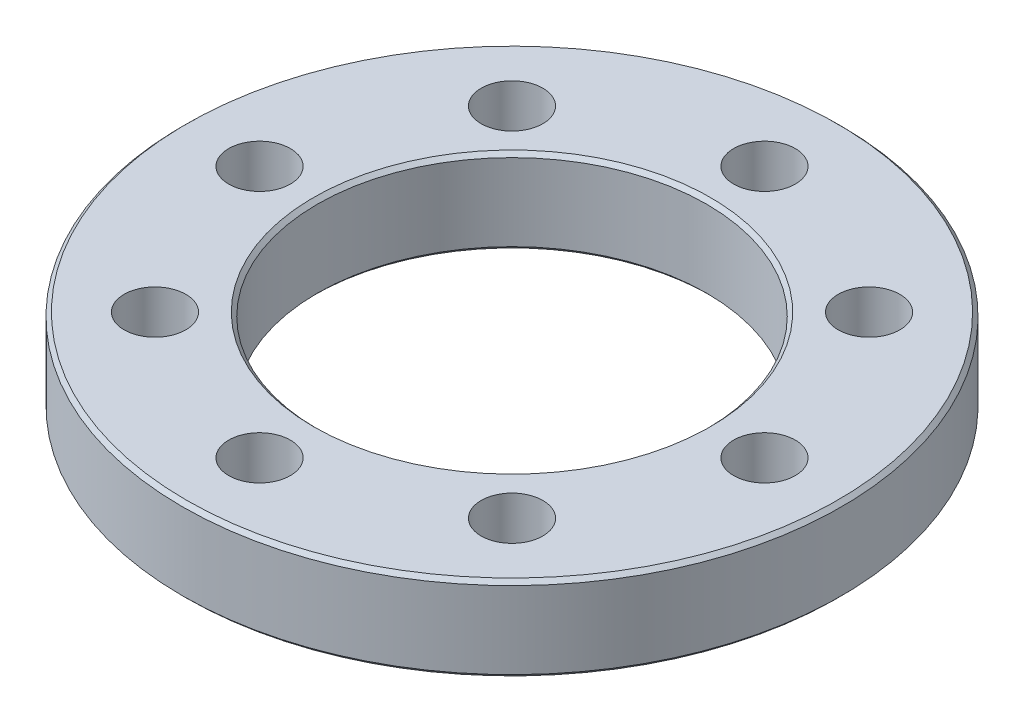
ISO-10303-21;
HEADER;
FILE_DESCRIPTION(('STEP AP214'),'2;1');
FILE_NAME('part.step','',(''),(''),'','','');
FILE_SCHEMA(('AUTOMOTIVE_DESIGN { 1 0 10303 214 1 1 1 1 }'));
ENDSEC;
DATA;
#1=APPLICATION_CONTEXT('core data for automotive mechanical design processes');
#2=APPLICATION_PROTOCOL_DEFINITION('international standard','automotive_design',2000,#1);
#3=PRODUCT_CONTEXT('',#1,'mechanical');
#4=PRODUCT('Part','Part','',(#3));
#5=PRODUCT_RELATED_PRODUCT_CATEGORY('part','',(#4));
#6=PRODUCT_DEFINITION_FORMATION('','',#4);
#7=PRODUCT_DEFINITION_CONTEXT('part definition',#1,'design');
#8=PRODUCT_DEFINITION('design','',#6,#7);
#9=PRODUCT_DEFINITION_SHAPE('','',#8);
#10=(LENGTH_UNIT() NAMED_UNIT(*) SI_UNIT(.MILLI.,.METRE.));
#11=(NAMED_UNIT(*) PLANE_ANGLE_UNIT() SI_UNIT($,.RADIAN.));
#12=(NAMED_UNIT(*) SI_UNIT($,.STERADIAN.) SOLID_ANGLE_UNIT());
#13=UNCERTAINTY_MEASURE_WITH_UNIT(LENGTH_MEASURE(1.E-05),#10,'distance_accuracy_value','');
#14=(GEOMETRIC_REPRESENTATION_CONTEXT(3) GLOBAL_UNCERTAINTY_ASSIGNED_CONTEXT((#13)) GLOBAL_UNIT_ASSIGNED_CONTEXT((#10,
#11,#12)) REPRESENTATION_CONTEXT('',''));
#15=CARTESIAN_POINT('',(0.,0.,0.));
#16=DIRECTION('',(0.,0.,1.));
#17=DIRECTION('',(1.,0.,0.));
#18=AXIS2_PLACEMENT_3D('',#15,#16,#17);
#19=CARTESIAN_POINT('',(0.,22.,0.));
#20=DIRECTION('',(0.,1.,0.));
#21=DIRECTION('',(0.,0.,1.));
#22=AXIS2_PLACEMENT_3D('',#19,#20,#21);
#23=PLANE('',#22);
#24=CARTESIAN_POINT('',(65.5,22.,0.));
#25=DIRECTION('',(0.,1.,0.));
#26=DIRECTION('',(0.,0.,1.));
#27=AXIS2_PLACEMENT_3D('',#24,#25,#26);
#28=CIRCLE('',#27,8.00000000000002);
#29=CARTESIAN_POINT('',(65.5,22.,8.00000000000002));
#30=VERTEX_POINT('',#29);
#31=EDGE_CURVE('E117',#30,#30,#28,.T.);
#32=ORIENTED_EDGE('',*,*,#31,.F.);
#33=EDGE_LOOP('',(#32));
#34=FACE_BOUND('',#33,.T.);
#35=CARTESIAN_POINT('',(46.3154941677188,22.,46.315494167719));
#36=DIRECTION('',(0.,1.,0.));
#37=DIRECTION('',(0.,0.,1.));
#38=AXIS2_PLACEMENT_3D('',#35,#36,#37);
#39=CIRCLE('',#38,8.00000000000001);
#40=CARTESIAN_POINT('',(46.3154941677188,22.,54.315494167719));
#41=VERTEX_POINT('',#40);
#42=EDGE_CURVE('E111',#41,#41,#39,.T.);
#43=ORIENTED_EDGE('',*,*,#42,.F.);
#44=EDGE_LOOP('',(#43));
#45=FACE_BOUND('',#44,.T.);
#46=CARTESIAN_POINT('',(-2.28692027694225E-13,22.,65.5));
#47=DIRECTION('',(0.,1.,0.));
#48=DIRECTION('',(0.,0.,1.));
#49=AXIS2_PLACEMENT_3D('',#46,#47,#48);
#50=CIRCLE('',#49,8.00000000000001);
#51=CARTESIAN_POINT('',(-2.28692027694225E-13,22.,73.5));
#52=VERTEX_POINT('',#51);
#53=EDGE_CURVE('E105',#52,#52,#50,.T.);
#54=ORIENTED_EDGE('',*,*,#53,.F.);
#55=EDGE_LOOP('',(#54));
#56=FACE_BOUND('',#55,.T.);
#57=CARTESIAN_POINT('',(-46.3154941677191,22.,46.3154941677186));
#58=DIRECTION('',(0.,1.,0.));
#59=DIRECTION('',(0.,0.,1.));
#60=AXIS2_PLACEMENT_3D('',#57,#58,#59);
#61=CIRCLE('',#60,8.00000000000001);
#62=CARTESIAN_POINT('',(-46.3154941677191,22.,54.3154941677187));
#63=VERTEX_POINT('',#62);
#64=EDGE_CURVE('E99',#63,#63,#61,.T.);
#65=ORIENTED_EDGE('',*,*,#64,.F.);
#66=EDGE_LOOP('',(#65));
#67=FACE_BOUND('',#66,.T.);
#68=CARTESIAN_POINT('',(-65.5,22.,-4.57384055388451E-13));
#69=DIRECTION('',(0.,1.,0.));
#70=DIRECTION('',(0.,0.,1.));
#71=AXIS2_PLACEMENT_3D('',#68,#69,#70);
#72=CIRCLE('',#71,8.00000000000001);
#73=CARTESIAN_POINT('',(-65.5,22.,7.99999999999956));
#74=VERTEX_POINT('',#73);
#75=EDGE_CURVE('E93',#74,#74,#72,.T.);
#76=ORIENTED_EDGE('',*,*,#75,.F.);
#77=EDGE_LOOP('',(#76));
#78=FACE_BOUND('',#77,.T.);
#79=CARTESIAN_POINT('',(-46.3154941677185,22.,-46.3154941677193));
#80=DIRECTION('',(0.,1.,0.));
#81=DIRECTION('',(0.,0.,1.));
#82=AXIS2_PLACEMENT_3D('',#79,#80,#81);
#83=CIRCLE('',#82,8.00000000000001);
#84=CARTESIAN_POINT('',(-46.3154941677185,22.,-38.3154941677193));
#85=VERTEX_POINT('',#84);
#86=EDGE_CURVE('E87',#85,#85,#83,.T.);
#87=ORIENTED_EDGE('',*,*,#86,.F.);
#88=EDGE_LOOP('',(#87));
#89=FACE_BOUND('',#88,.T.);
#90=CARTESIAN_POINT('',(6.86076083082676E-13,22.,-65.5));
#91=DIRECTION('',(0.,1.,0.));
#92=DIRECTION('',(0.,0.,1.));
#93=AXIS2_PLACEMENT_3D('',#90,#91,#92);
#94=CIRCLE('',#93,8.00000000000001);
#95=CARTESIAN_POINT('',(6.86076083082676E-13,22.,-57.5));
#96=VERTEX_POINT('',#95);
#97=EDGE_CURVE('E81',#96,#96,#94,.T.);
#98=ORIENTED_EDGE('',*,*,#97,.F.);
#99=EDGE_LOOP('',(#98));
#100=FACE_BOUND('',#99,.T.);
#101=CARTESIAN_POINT('',(46.3154941677194,22.,-46.3154941677183));
#102=DIRECTION('',(0.,1.,0.));
#103=DIRECTION('',(0.,0.,1.));
#104=AXIS2_PLACEMENT_3D('',#101,#102,#103);
#105=CIRCLE('',#104,8.00000000000001);
#106=CARTESIAN_POINT('',(46.3154941677194,22.,-38.3154941677183));
#107=VERTEX_POINT('',#106);
#108=EDGE_CURVE('E75',#107,#107,#105,.T.);
#109=ORIENTED_EDGE('',*,*,#108,.F.);
#110=EDGE_LOOP('',(#109));
#111=FACE_BOUND('',#110,.T.);
#112=CARTESIAN_POINT('',(0.,22.,0.));
#113=DIRECTION('',(0.,1.,0.));
#114=DIRECTION('',(0.,0.,1.));
#115=AXIS2_PLACEMENT_3D('',#112,#113,#114);
#116=CIRCLE('',#115,84.5);
#117=CARTESIAN_POINT('',(0.,22.,84.5));
#118=VERTEX_POINT('',#117);
#119=EDGE_CURVE('E51',#118,#118,#116,.T.);
#120=ORIENTED_EDGE('',*,*,#119,.T.);
#121=EDGE_LOOP('',(#120));
#122=FACE_BOUND('',#121,.T.);
#123=CARTESIAN_POINT('',(0.,22.,0.));
#124=DIRECTION('',(0.,1.,0.));
#125=DIRECTION('',(0.,0.,1.));
#126=AXIS2_PLACEMENT_3D('',#123,#124,#125);
#127=CIRCLE('',#126,51.5);
#128=CARTESIAN_POINT('',(0.,22.,51.5));
#129=VERTEX_POINT('',#128);
#130=EDGE_CURVE('E55',#129,#129,#127,.F.);
#131=ORIENTED_EDGE('',*,*,#130,.T.);
#132=EDGE_LOOP('',(#131));
#133=FACE_BOUND('',#132,.T.);
#134=ADVANCED_FACE('F39',(#34,#45,#56,#67,#78,#89,#100,#111,#122,#133),#23,.T.);
#135=CARTESIAN_POINT('',(0.,0.,0.));
#136=DIRECTION('',(0.,1.,0.));
#137=DIRECTION('',(0.,0.,1.));
#138=AXIS2_PLACEMENT_3D('',#135,#136,#137);
#139=PLANE('',#138);
#140=CARTESIAN_POINT('',(65.5,0.,0.));
#141=DIRECTION('',(0.,1.,0.));
#142=DIRECTION('',(0.,0.,1.));
#143=AXIS2_PLACEMENT_3D('',#140,#141,#142);
#144=CIRCLE('',#143,8.00000000000001);
#145=CARTESIAN_POINT('',(65.5,0.,8.00000000000001));
#146=VERTEX_POINT('',#145);
#147=EDGE_CURVE('E114',#146,#146,#144,.T.);
#148=ORIENTED_EDGE('',*,*,#147,.T.);
#149=EDGE_LOOP('',(#148));
#150=FACE_BOUND('',#149,.T.);
#151=CARTESIAN_POINT('',(46.3154941677188,0.,46.315494167719));
#152=DIRECTION('',(0.,1.,0.));
#153=DIRECTION('',(0.,0.,1.));
#154=AXIS2_PLACEMENT_3D('',#151,#152,#153);
#155=CIRCLE('',#154,8.00000000000001);
#156=CARTESIAN_POINT('',(46.3154941677188,0.,54.315494167719));
#157=VERTEX_POINT('',#156);
#158=EDGE_CURVE('E108',#157,#157,#155,.T.);
#159=ORIENTED_EDGE('',*,*,#158,.T.);
#160=EDGE_LOOP('',(#159));
#161=FACE_BOUND('',#160,.T.);
#162=CARTESIAN_POINT('',(-2.28692027694225E-13,0.,65.5));
#163=DIRECTION('',(0.,1.,0.));
#164=DIRECTION('',(0.,0.,1.));
#165=AXIS2_PLACEMENT_3D('',#162,#163,#164);
#166=CIRCLE('',#165,8.00000000000001);
#167=CARTESIAN_POINT('',(-2.28692027694225E-13,0.,73.5));
#168=VERTEX_POINT('',#167);
#169=EDGE_CURVE('E102',#168,#168,#166,.T.);
#170=ORIENTED_EDGE('',*,*,#169,.T.);
#171=EDGE_LOOP('',(#170));
#172=FACE_BOUND('',#171,.T.);
#173=CARTESIAN_POINT('',(-46.3154941677191,0.,46.3154941677186));
#174=DIRECTION('',(0.,1.,0.));
#175=DIRECTION('',(0.,0.,1.));
#176=AXIS2_PLACEMENT_3D('',#173,#174,#175);
#177=CIRCLE('',#176,8.00000000000001);
#178=CARTESIAN_POINT('',(-46.3154941677191,0.,54.3154941677186));
#179=VERTEX_POINT('',#178);
#180=EDGE_CURVE('E96',#179,#179,#177,.T.);
#181=ORIENTED_EDGE('',*,*,#180,.T.);
#182=EDGE_LOOP('',(#181));
#183=FACE_BOUND('',#182,.T.);
#184=CARTESIAN_POINT('',(-65.5,0.,-4.57384055388451E-13));
#185=DIRECTION('',(0.,1.,0.));
#186=DIRECTION('',(0.,0.,1.));
#187=AXIS2_PLACEMENT_3D('',#184,#185,#186);
#188=CIRCLE('',#187,8.00000000000001);
#189=CARTESIAN_POINT('',(-65.5,0.,7.99999999999955));
#190=VERTEX_POINT('',#189);
#191=EDGE_CURVE('E90',#190,#190,#188,.T.);
#192=ORIENTED_EDGE('',*,*,#191,.T.);
#193=EDGE_LOOP('',(#192));
#194=FACE_BOUND('',#193,.T.);
#195=CARTESIAN_POINT('',(-46.3154941677185,0.,-46.3154941677193));
#196=DIRECTION('',(0.,1.,0.));
#197=DIRECTION('',(0.,0.,1.));
#198=AXIS2_PLACEMENT_3D('',#195,#196,#197);
#199=CIRCLE('',#198,8.00000000000001);
#200=CARTESIAN_POINT('',(-46.3154941677185,0.,-38.3154941677193));
#201=VERTEX_POINT('',#200);
#202=EDGE_CURVE('E84',#201,#201,#199,.T.);
#203=ORIENTED_EDGE('',*,*,#202,.T.);
#204=EDGE_LOOP('',(#203));
#205=FACE_BOUND('',#204,.T.);
#206=CARTESIAN_POINT('',(6.86076083082676E-13,0.,-65.5));
#207=DIRECTION('',(0.,1.,0.));
#208=DIRECTION('',(0.,0.,1.));
#209=AXIS2_PLACEMENT_3D('',#206,#207,#208);
#210=CIRCLE('',#209,8.00000000000001);
#211=CARTESIAN_POINT('',(6.86076083082676E-13,0.,-57.5));
#212=VERTEX_POINT('',#211);
#213=EDGE_CURVE('E78',#212,#212,#210,.T.);
#214=ORIENTED_EDGE('',*,*,#213,.T.);
#215=EDGE_LOOP('',(#214));
#216=FACE_BOUND('',#215,.T.);
#217=CARTESIAN_POINT('',(46.3154941677194,0.,-46.3154941677183));
#218=DIRECTION('',(0.,1.,0.));
#219=DIRECTION('',(0.,0.,1.));
#220=AXIS2_PLACEMENT_3D('',#217,#218,#219);
#221=CIRCLE('',#220,8.00000000000001);
#222=CARTESIAN_POINT('',(46.3154941677194,0.,-38.3154941677183));
#223=VERTEX_POINT('',#222);
#224=EDGE_CURVE('E72',#223,#223,#221,.T.);
#225=ORIENTED_EDGE('',*,*,#224,.T.);
#226=EDGE_LOOP('',(#225));
#227=FACE_BOUND('',#226,.T.);
#228=CARTESIAN_POINT('',(0.,0.,0.));
#229=DIRECTION('',(0.,1.,0.));
#230=DIRECTION('',(0.,0.,1.));
#231=AXIS2_PLACEMENT_3D('',#228,#229,#230);
#232=CIRCLE('',#231,84.5);
#233=CARTESIAN_POINT('',(0.,0.,84.5));
#234=VERTEX_POINT('',#233);
#235=EDGE_CURVE('E60',#234,#234,#232,.F.);
#236=ORIENTED_EDGE('',*,*,#235,.T.);
#237=EDGE_LOOP('',(#236));
#238=FACE_BOUND('',#237,.T.);
#239=CARTESIAN_POINT('',(0.,0.,0.));
#240=DIRECTION('',(0.,1.,0.));
#241=DIRECTION('',(0.,0.,1.));
#242=AXIS2_PLACEMENT_3D('',#239,#240,#241);
#243=CIRCLE('',#242,51.5);
#244=CARTESIAN_POINT('',(0.,0.,51.5));
#245=VERTEX_POINT('',#244);
#246=EDGE_CURVE('E63',#245,#245,#243,.T.);
#247=ORIENTED_EDGE('',*,*,#246,.T.);
#248=EDGE_LOOP('',(#247));
#249=FACE_BOUND('',#248,.T.);
#250=ADVANCED_FACE('F125',(#150,#161,#172,#183,#194,#205,#216,#227,#238,#249),#139,.F.);
#251=CARTESIAN_POINT('',(0.,22.,0.));
#252=DIRECTION('',(0.,-1.,0.));
#253=DIRECTION('',(0.,0.,-1.));
#254=AXIS2_PLACEMENT_3D('',#251,#252,#253);
#255=CYLINDRICAL_SURFACE('',#254,85.5);
#256=CARTESIAN_POINT('',(0.,1.,0.));
#257=DIRECTION('',(0.,1.,0.));
#258=DIRECTION('',(0.,0.,1.));
#259=AXIS2_PLACEMENT_3D('',#256,#257,#258);
#260=CIRCLE('',#259,85.5);
#261=CARTESIAN_POINT('',(0.,1.,85.5));
#262=VERTEX_POINT('',#261);
#263=EDGE_CURVE('E66',#262,#262,#260,.T.);
#264=ORIENTED_EDGE('',*,*,#263,.T.);
#265=EDGE_LOOP('',(#264));
#266=FACE_BOUND('',#265,.T.);
#267=CARTESIAN_POINT('',(0.,21.,0.));
#268=DIRECTION('',(0.,1.,0.));
#269=DIRECTION('',(0.,0.,1.));
#270=AXIS2_PLACEMENT_3D('',#267,#268,#269);
#271=CIRCLE('',#270,85.5);
#272=CARTESIAN_POINT('',(0.,21.,85.5));
#273=VERTEX_POINT('',#272);
#274=EDGE_CURVE('E69',#273,#273,#271,.F.);
#275=ORIENTED_EDGE('',*,*,#274,.T.);
#276=EDGE_LOOP('',(#275));
#277=FACE_BOUND('',#276,.T.);
#278=ADVANCED_FACE('F179',(#266,#277),#255,.T.);
#279=CARTESIAN_POINT('',(0.,22.,0.));
#280=DIRECTION('',(0.,-1.,0.));
#281=DIRECTION('',(0.,0.,-1.));
#282=AXIS2_PLACEMENT_3D('',#279,#280,#281);
#283=CYLINDRICAL_SURFACE('',#282,50.5);
#284=CARTESIAN_POINT('',(0.,1.00000000000001,0.));
#285=DIRECTION('',(0.,1.,0.));
#286=DIRECTION('',(0.,0.,1.));
#287=AXIS2_PLACEMENT_3D('',#284,#285,#286);
#288=CIRCLE('',#287,50.5);
#289=CARTESIAN_POINT('',(0.,1.00000000000001,50.5));
#290=VERTEX_POINT('',#289);
#291=EDGE_CURVE('E10',#290,#290,#288,.F.);
#292=ORIENTED_EDGE('',*,*,#291,.T.);
#293=EDGE_LOOP('',(#292));
#294=FACE_BOUND('',#293,.T.);
#295=CARTESIAN_POINT('',(0.,21.,0.));
#296=DIRECTION('',(0.,1.,0.));
#297=DIRECTION('',(0.,0.,1.));
#298=AXIS2_PLACEMENT_3D('',#295,#296,#297);
#299=CIRCLE('',#298,50.5);
#300=CARTESIAN_POINT('',(0.,21.,50.5));
#301=VERTEX_POINT('',#300);
#302=EDGE_CURVE('E47',#301,#301,#299,.T.);
#303=ORIENTED_EDGE('',*,*,#302,.T.);
#304=EDGE_LOOP('',(#303));
#305=FACE_BOUND('',#304,.T.);
#306=ADVANCED_FACE('F177',(#294,#305),#283,.F.);
#307=CARTESIAN_POINT('',(0.,1.,0.));
#308=DIRECTION('',(0.,1.,0.));
#309=DIRECTION('',(0.,0.,1.));
#310=AXIS2_PLACEMENT_3D('',#307,#308,#309);
#311=CONICAL_SURFACE('',#310,85.5,0.785398163397455);
#312=ORIENTED_EDGE('',*,*,#235,.F.);
#313=EDGE_LOOP('',(#312));
#314=FACE_BOUND('',#313,.T.);
#315=ORIENTED_EDGE('',*,*,#263,.F.);
#316=EDGE_LOOP('',(#315));
#317=FACE_BOUND('',#316,.T.);
#318=ADVANCED_FACE('F161',(#314,#317),#311,.T.);
#319=CARTESIAN_POINT('',(0.,22.,0.));
#320=DIRECTION('',(0.,-1.,0.));
#321=DIRECTION('',(0.,0.,-1.));
#322=AXIS2_PLACEMENT_3D('',#319,#320,#321);
#323=CONICAL_SURFACE('',#322,84.5,0.785398163397441);
#324=ORIENTED_EDGE('',*,*,#274,.F.);
#325=EDGE_LOOP('',(#324));
#326=FACE_BOUND('',#325,.T.);
#327=ORIENTED_EDGE('',*,*,#119,.F.);
#328=EDGE_LOOP('',(#327));
#329=FACE_BOUND('',#328,.T.);
#330=ADVANCED_FACE('F156',(#326,#329),#323,.T.);
#331=CARTESIAN_POINT('',(0.,0.,0.));
#332=DIRECTION('',(0.,-1.,0.));
#333=DIRECTION('',(0.,0.,-1.));
#334=AXIS2_PLACEMENT_3D('',#331,#332,#333);
#335=CONICAL_SURFACE('',#334,51.5,0.785398163397434);
#336=ORIENTED_EDGE('',*,*,#291,.F.);
#337=EDGE_LOOP('',(#336));
#338=FACE_BOUND('',#337,.T.);
#339=ORIENTED_EDGE('',*,*,#246,.F.);
#340=EDGE_LOOP('',(#339));
#341=FACE_BOUND('',#340,.T.);
#342=ADVANCED_FACE('F148',(#338,#341),#335,.F.);
#343=CARTESIAN_POINT('',(0.,21.,0.));
#344=DIRECTION('',(0.,1.,0.));
#345=DIRECTION('',(0.,0.,1.));
#346=AXIS2_PLACEMENT_3D('',#343,#344,#345);
#347=CONICAL_SURFACE('',#346,50.5,0.785398163397455);
#348=ORIENTED_EDGE('',*,*,#130,.F.);
#349=EDGE_LOOP('',(#348));
#350=FACE_BOUND('',#349,.T.);
#351=ORIENTED_EDGE('',*,*,#302,.F.);
#352=EDGE_LOOP('',(#351));
#353=FACE_BOUND('',#352,.T.);
#354=ADVANCED_FACE('F42',(#350,#353),#347,.F.);
#355=CARTESIAN_POINT('',(46.3154941677194,22.,-46.3154941677183));
#356=DIRECTION('',(0.,1.,0.));
#357=DIRECTION('',(0.,0.,1.));
#358=AXIS2_PLACEMENT_3D('',#355,#356,#357);
#359=CYLINDRICAL_SURFACE('',#358,8.00000000000001);
#360=ORIENTED_EDGE('',*,*,#224,.F.);
#361=EDGE_LOOP('',(#360));
#362=FACE_BOUND('',#361,.T.);
#363=ORIENTED_EDGE('',*,*,#108,.T.);
#364=EDGE_LOOP('',(#363));
#365=FACE_BOUND('',#364,.T.);
#366=ADVANCED_FACE('F147',(#362,#365),#359,.F.);
#367=CARTESIAN_POINT('',(6.86076083082676E-13,22.,-65.5));
#368=DIRECTION('',(0.,1.,0.));
#369=DIRECTION('',(0.,0.,1.));
#370=AXIS2_PLACEMENT_3D('',#367,#368,#369);
#371=CYLINDRICAL_SURFACE('',#370,8.00000000000001);
#372=ORIENTED_EDGE('',*,*,#213,.F.);
#373=EDGE_LOOP('',(#372));
#374=FACE_BOUND('',#373,.T.);
#375=ORIENTED_EDGE('',*,*,#97,.T.);
#376=EDGE_LOOP('',(#375));
#377=FACE_BOUND('',#376,.T.);
#378=ADVANCED_FACE('F153',(#374,#377),#371,.F.);
#379=CARTESIAN_POINT('',(-46.3154941677185,22.,-46.3154941677193));
#380=DIRECTION('',(0.,1.,0.));
#381=DIRECTION('',(0.,0.,1.));
#382=AXIS2_PLACEMENT_3D('',#379,#380,#381);
#383=CYLINDRICAL_SURFACE('',#382,8.00000000000001);
#384=ORIENTED_EDGE('',*,*,#202,.F.);
#385=EDGE_LOOP('',(#384));
#386=FACE_BOUND('',#385,.T.);
#387=ORIENTED_EDGE('',*,*,#86,.T.);
#388=EDGE_LOOP('',(#387));
#389=FACE_BOUND('',#388,.T.);
#390=ADVANCED_FACE('F190',(#386,#389),#383,.F.);
#391=CARTESIAN_POINT('',(-65.5,22.,-4.57384055388451E-13));
#392=DIRECTION('',(0.,1.,0.));
#393=DIRECTION('',(0.,0.,1.));
#394=AXIS2_PLACEMENT_3D('',#391,#392,#393);
#395=CYLINDRICAL_SURFACE('',#394,8.00000000000001);
#396=ORIENTED_EDGE('',*,*,#191,.F.);
#397=EDGE_LOOP('',(#396));
#398=FACE_BOUND('',#397,.T.);
#399=ORIENTED_EDGE('',*,*,#75,.T.);
#400=EDGE_LOOP('',(#399));
#401=FACE_BOUND('',#400,.T.);
#402=ADVANCED_FACE('F194',(#398,#401),#395,.F.);
#403=CARTESIAN_POINT('',(-46.3154941677191,22.,46.3154941677186));
#404=DIRECTION('',(0.,1.,0.));
#405=DIRECTION('',(0.,0.,1.));
#406=AXIS2_PLACEMENT_3D('',#403,#404,#405);
#407=CYLINDRICAL_SURFACE('',#406,8.00000000000001);
#408=ORIENTED_EDGE('',*,*,#180,.F.);
#409=EDGE_LOOP('',(#408));
#410=FACE_BOUND('',#409,.T.);
#411=ORIENTED_EDGE('',*,*,#64,.T.);
#412=EDGE_LOOP('',(#411));
#413=FACE_BOUND('',#412,.T.);
#414=ADVANCED_FACE('F198',(#410,#413),#407,.F.);
#415=CARTESIAN_POINT('',(-2.28692027694225E-13,22.,65.5));
#416=DIRECTION('',(0.,1.,0.));
#417=DIRECTION('',(0.,0.,1.));
#418=AXIS2_PLACEMENT_3D('',#415,#416,#417);
#419=CYLINDRICAL_SURFACE('',#418,8.00000000000001);
#420=ORIENTED_EDGE('',*,*,#169,.F.);
#421=EDGE_LOOP('',(#420));
#422=FACE_BOUND('',#421,.T.);
#423=ORIENTED_EDGE('',*,*,#53,.T.);
#424=EDGE_LOOP('',(#423));
#425=FACE_BOUND('',#424,.T.);
#426=ADVANCED_FACE('F202',(#422,#425),#419,.F.);
#427=CARTESIAN_POINT('',(46.3154941677188,22.,46.315494167719));
#428=DIRECTION('',(0.,1.,0.));
#429=DIRECTION('',(0.,0.,1.));
#430=AXIS2_PLACEMENT_3D('',#427,#428,#429);
#431=CYLINDRICAL_SURFACE('',#430,8.00000000000001);
#432=ORIENTED_EDGE('',*,*,#158,.F.);
#433=EDGE_LOOP('',(#432));
#434=FACE_BOUND('',#433,.T.);
#435=ORIENTED_EDGE('',*,*,#42,.T.);
#436=EDGE_LOOP('',(#435));
#437=FACE_BOUND('',#436,.T.);
#438=ADVANCED_FACE('F206',(#434,#437),#431,.F.);
#439=CARTESIAN_POINT('',(65.5,22.,0.));
#440=DIRECTION('',(0.,1.,0.));
#441=DIRECTION('',(0.,0.,1.));
#442=AXIS2_PLACEMENT_3D('',#439,#440,#441);
#443=CYLINDRICAL_SURFACE('',#442,8.00000000000001);
#444=ORIENTED_EDGE('',*,*,#147,.F.);
#445=EDGE_LOOP('',(#444));
#446=FACE_BOUND('',#445,.T.);
#447=ORIENTED_EDGE('',*,*,#31,.T.);
#448=EDGE_LOOP('',(#447));
#449=FACE_BOUND('',#448,.T.);
#450=ADVANCED_FACE('F121',(#446,#449),#443,.F.);
#451=CLOSED_SHELL('',(#134,#250,#278,#306,#318,#330,#342,#354,#366,#378,#390,#402,#414,#426,
#438,#450));
#452=MANIFOLD_SOLID_BREP('B2',#451);
#453=ADVANCED_BREP_SHAPE_REPRESENTATION('',(#18,#452),#14);
#454=SHAPE_DEFINITION_REPRESENTATION(#9,#453);
ENDSEC;
END-ISO-10303-21;
